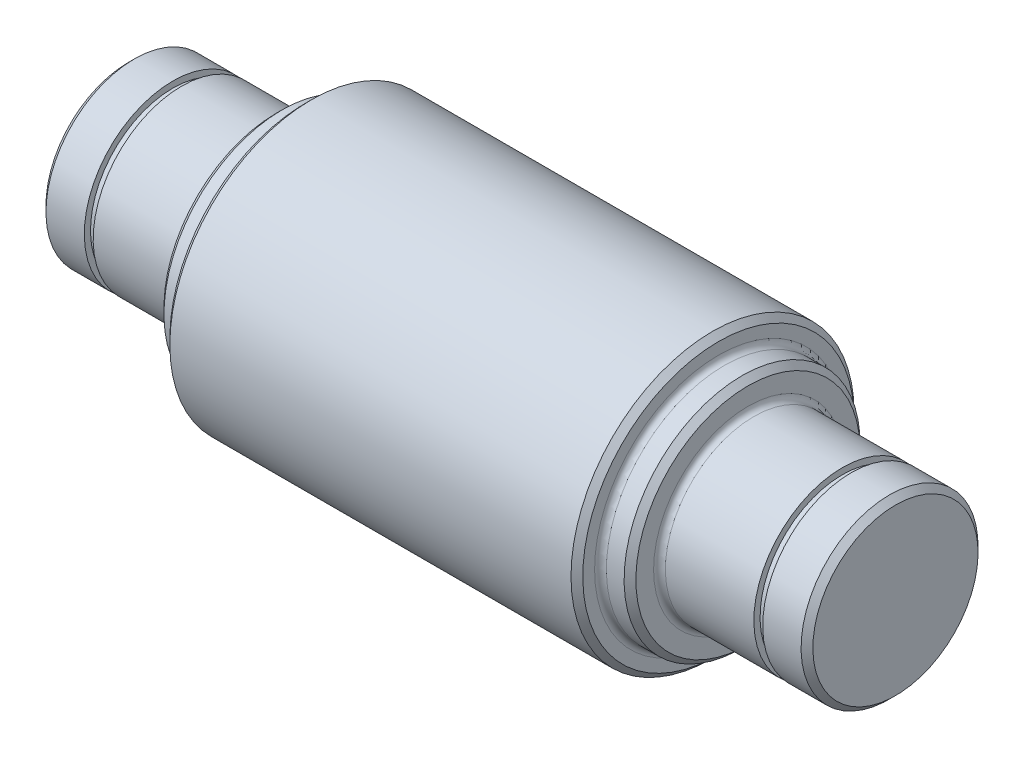
ISO-10303-21;
HEADER;
FILE_DESCRIPTION(('STEP AP214'),'2;1');
FILE_NAME('part.step','',(''),(''),'','','');
FILE_SCHEMA(('AUTOMOTIVE_DESIGN { 1 0 10303 214 1 1 1 1 }'));
ENDSEC;
DATA;
#1=APPLICATION_CONTEXT('core data for automotive mechanical design processes');
#2=APPLICATION_PROTOCOL_DEFINITION('international standard','automotive_design',2000,#1);
#3=PRODUCT_CONTEXT('',#1,'mechanical');
#4=PRODUCT('Part','Part','',(#3));
#5=PRODUCT_RELATED_PRODUCT_CATEGORY('part','',(#4));
#6=PRODUCT_DEFINITION_FORMATION('','',#4);
#7=PRODUCT_DEFINITION_CONTEXT('part definition',#1,'design');
#8=PRODUCT_DEFINITION('design','',#6,#7);
#9=PRODUCT_DEFINITION_SHAPE('','',#8);
#10=(LENGTH_UNIT() NAMED_UNIT(*) SI_UNIT(.MILLI.,.METRE.));
#11=(NAMED_UNIT(*) PLANE_ANGLE_UNIT() SI_UNIT($,.RADIAN.));
#12=(NAMED_UNIT(*) SI_UNIT($,.STERADIAN.) SOLID_ANGLE_UNIT());
#13=UNCERTAINTY_MEASURE_WITH_UNIT(LENGTH_MEASURE(1.E-05),#10,'distance_accuracy_value','');
#14=(GEOMETRIC_REPRESENTATION_CONTEXT(3) GLOBAL_UNCERTAINTY_ASSIGNED_CONTEXT((#13)) GLOBAL_UNIT_ASSIGNED_CONTEXT((#10,
#11,#12)) REPRESENTATION_CONTEXT('',''));
#15=CARTESIAN_POINT('',(0.,0.,0.));
#16=DIRECTION('',(0.,0.,1.));
#17=DIRECTION('',(1.,0.,0.));
#18=AXIS2_PLACEMENT_3D('',#15,#16,#17);
#19=CARTESIAN_POINT('',(16.1248599784287,0.,0.));
#20=DIRECTION('',(-1.,0.,0.));
#21=DIRECTION('',(0.,-1.,0.));
#22=AXIS2_PLACEMENT_3D('',#19,#20,#21);
#23=PLANE('',#22);
#24=CARTESIAN_POINT('',(16.1248599784287,0.,0.));
#25=DIRECTION('',(-1.,0.,0.));
#26=DIRECTION('',(0.,-1.,0.));
#27=AXIS2_PLACEMENT_3D('',#24,#25,#26);
#28=CIRCLE('',#27,13.125);
#29=CARTESIAN_POINT('',(16.1248599784287,-13.125,0.));
#30=VERTEX_POINT('',#29);
#31=EDGE_CURVE('E10',#30,#30,#28,.T.);
#32=ORIENTED_EDGE('',*,*,#31,.F.);
#33=EDGE_LOOP('',(#32));
#34=FACE_BOUND('',#33,.T.);
#35=CARTESIAN_POINT('',(16.1248599784287,0.,0.));
#36=DIRECTION('',(-1.,0.,0.));
#37=DIRECTION('',(0.,-1.,0.));
#38=AXIS2_PLACEMENT_3D('',#35,#36,#37);
#39=CIRCLE('',#38,14.375);
#40=CARTESIAN_POINT('',(16.1248599784287,-14.375,0.));
#41=VERTEX_POINT('',#40);
#42=EDGE_CURVE('E63',#41,#41,#39,.T.);
#43=ORIENTED_EDGE('',*,*,#42,.T.);
#44=EDGE_LOOP('',(#43));
#45=FACE_BOUND('',#44,.T.);
#46=ADVANCED_FACE('F48',(#34,#45),#23,.T.);
#47=CARTESIAN_POINT('',(78.6248599784287,0.,0.));
#48=DIRECTION('',(1.,0.,0.));
#49=DIRECTION('',(0.,1.,0.));
#50=AXIS2_PLACEMENT_3D('',#47,#48,#49);
#51=CYLINDRICAL_SURFACE('',#50,15.);
#52=CARTESIAN_POINT('',(59.2498599784287,0.,0.));
#53=DIRECTION('',(1.,0.,0.));
#54=DIRECTION('',(0.,1.,0.));
#55=AXIS2_PLACEMENT_3D('',#52,#53,#54);
#56=CIRCLE('',#55,15.);
#57=CARTESIAN_POINT('',(59.2498599784287,15.,0.));
#58=VERTEX_POINT('',#57);
#59=EDGE_CURVE('E68',#58,#58,#56,.F.);
#60=ORIENTED_EDGE('',*,*,#59,.T.);
#61=EDGE_LOOP('',(#60));
#62=FACE_BOUND('',#61,.T.);
#63=CARTESIAN_POINT('',(16.7498599784287,0.,0.));
#64=DIRECTION('',(-1.,0.,0.));
#65=DIRECTION('',(0.,-1.,0.));
#66=AXIS2_PLACEMENT_3D('',#63,#64,#65);
#67=CIRCLE('',#66,15.);
#68=CARTESIAN_POINT('',(16.7498599784287,-15.,0.));
#69=VERTEX_POINT('',#68);
#70=EDGE_CURVE('E71',#69,#69,#67,.F.);
#71=ORIENTED_EDGE('',*,*,#70,.T.);
#72=EDGE_LOOP('',(#71));
#73=FACE_BOUND('',#72,.T.);
#74=ADVANCED_FACE('F160',(#62,#73),#51,.T.);
#75=CARTESIAN_POINT('',(59.8748599784287,15.,0.));
#76=DIRECTION('',(1.,0.,0.));
#77=DIRECTION('',(0.,1.,0.));
#78=AXIS2_PLACEMENT_3D('',#75,#76,#77);
#79=PLANE('',#78);
#80=CARTESIAN_POINT('',(59.8748599784287,0.,0.));
#81=DIRECTION('',(1.,0.,0.));
#82=DIRECTION('',(0.,1.,0.));
#83=AXIS2_PLACEMENT_3D('',#80,#81,#82);
#84=CIRCLE('',#83,14.375);
#85=CARTESIAN_POINT('',(59.8748599784287,14.375,0.));
#86=VERTEX_POINT('',#85);
#87=EDGE_CURVE('E74',#86,#86,#84,.T.);
#88=ORIENTED_EDGE('',*,*,#87,.T.);
#89=EDGE_LOOP('',(#88));
#90=FACE_BOUND('',#89,.T.);
#91=CARTESIAN_POINT('',(59.8748599784287,0.,0.));
#92=DIRECTION('',(1.,0.,0.));
#93=DIRECTION('',(0.,1.,0.));
#94=AXIS2_PLACEMENT_3D('',#91,#92,#93);
#95=CIRCLE('',#94,13.125);
#96=CARTESIAN_POINT('',(59.8748599784287,13.125,0.));
#97=VERTEX_POINT('',#96);
#98=EDGE_CURVE('E83',#97,#97,#95,.F.);
#99=ORIENTED_EDGE('',*,*,#98,.T.);
#100=EDGE_LOOP('',(#99));
#101=FACE_BOUND('',#100,.T.);
#102=ADVANCED_FACE('F166',(#90,#101),#79,.T.);
#103=CARTESIAN_POINT('',(78.6248599784287,0.,0.));
#104=DIRECTION('',(1.,0.,0.));
#105=DIRECTION('',(0.,1.,0.));
#106=AXIS2_PLACEMENT_3D('',#103,#104,#105);
#107=CYLINDRICAL_SURFACE('',#106,12.5);
#108=CARTESIAN_POINT('',(62.3748599784287,0.,0.));
#109=DIRECTION('',(1.,0.,0.));
#110=DIRECTION('',(0.,1.,0.));
#111=AXIS2_PLACEMENT_3D('',#108,#109,#110);
#112=CIRCLE('',#111,12.5);
#113=CARTESIAN_POINT('',(62.3748599784287,12.5,0.));
#114=VERTEX_POINT('',#113);
#115=EDGE_CURVE('E77',#114,#114,#112,.F.);
#116=ORIENTED_EDGE('',*,*,#115,.T.);
#117=EDGE_LOOP('',(#116));
#118=FACE_BOUND('',#117,.T.);
#119=CARTESIAN_POINT('',(60.4998599784287,0.,0.));
#120=DIRECTION('',(1.,0.,0.));
#121=DIRECTION('',(0.,1.,0.));
#122=AXIS2_PLACEMENT_3D('',#119,#120,#121);
#123=CIRCLE('',#122,12.5);
#124=CARTESIAN_POINT('',(60.4998599784287,12.5,0.));
#125=VERTEX_POINT('',#124);
#126=EDGE_CURVE('E86',#125,#125,#123,.T.);
#127=ORIENTED_EDGE('',*,*,#126,.T.);
#128=EDGE_LOOP('',(#127));
#129=FACE_BOUND('',#128,.T.);
#130=ADVANCED_FACE('F239',(#118,#129),#107,.T.);
#131=CARTESIAN_POINT('',(62.9998599784287,12.5,0.));
#132=DIRECTION('',(1.,0.,0.));
#133=DIRECTION('',(0.,1.,0.));
#134=AXIS2_PLACEMENT_3D('',#131,#132,#133);
#135=PLANE('',#134);
#136=CARTESIAN_POINT('',(62.9998599784287,0.,0.));
#137=DIRECTION('',(1.,0.,0.));
#138=DIRECTION('',(0.,1.,0.));
#139=AXIS2_PLACEMENT_3D('',#136,#137,#138);
#140=CIRCLE('',#139,11.875);
#141=CARTESIAN_POINT('',(62.9998599784287,11.875,0.));
#142=VERTEX_POINT('',#141);
#143=EDGE_CURVE('E80',#142,#142,#140,.T.);
#144=ORIENTED_EDGE('',*,*,#143,.T.);
#145=EDGE_LOOP('',(#144));
#146=FACE_BOUND('',#145,.T.);
#147=CARTESIAN_POINT('',(62.9998599784287,0.,0.));
#148=DIRECTION('',(1.,0.,0.));
#149=DIRECTION('',(0.,1.,0.));
#150=AXIS2_PLACEMENT_3D('',#147,#148,#149);
#151=CIRCLE('',#150,10.);
#152=CARTESIAN_POINT('',(62.9998599784287,10.,0.));
#153=VERTEX_POINT('',#152);
#154=EDGE_CURVE('E89',#153,#153,#151,.F.);
#155=ORIENTED_EDGE('',*,*,#154,.T.);
#156=EDGE_LOOP('',(#155));
#157=FACE_BOUND('',#156,.T.);
#158=ADVANCED_FACE('F235',(#146,#157),#135,.T.);
#159=CARTESIAN_POINT('',(78.6248599784287,0.,0.));
#160=DIRECTION('',(1.,0.,0.));
#161=DIRECTION('',(0.,1.,0.));
#162=AXIS2_PLACEMENT_3D('',#159,#160,#161);
#163=CYLINDRICAL_SURFACE('',#162,9.375);
#164=CARTESIAN_POINT('',(63.6248599784287,0.,0.));
#165=DIRECTION('',(1.,0.,0.));
#166=DIRECTION('',(0.,1.,0.));
#167=AXIS2_PLACEMENT_3D('',#164,#165,#166);
#168=CIRCLE('',#167,9.375);
#169=CARTESIAN_POINT('',(63.6248599784287,9.375,0.));
#170=VERTEX_POINT('',#169);
#171=EDGE_CURVE('E92',#170,#170,#168,.T.);
#172=ORIENTED_EDGE('',*,*,#171,.T.);
#173=EDGE_LOOP('',(#172));
#174=FACE_BOUND('',#173,.T.);
#175=CARTESIAN_POINT('',(72.9998599784287,0.,0.));
#176=DIRECTION('',(1.,0.,0.));
#177=DIRECTION('',(0.,1.,0.));
#178=AXIS2_PLACEMENT_3D('',#175,#176,#177);
#179=CIRCLE('',#178,9.375);
#180=CARTESIAN_POINT('',(72.9998599784287,9.37499999999999,0.));
#181=VERTEX_POINT('',#180);
#182=EDGE_CURVE('E95',#181,#181,#179,.T.);
#183=ORIENTED_EDGE('',*,*,#182,.F.);
#184=EDGE_LOOP('',(#183));
#185=FACE_BOUND('',#184,.T.);
#186=ADVANCED_FACE('F231',(#174,#185),#163,.T.);
#187=CARTESIAN_POINT('',(72.9998599784287,9.37499999999999,0.));
#188=DIRECTION('',(1.,0.,0.));
#189=DIRECTION('',(0.,1.,0.));
#190=AXIS2_PLACEMENT_3D('',#187,#188,#189);
#191=PLANE('',#190);
#192=ORIENTED_EDGE('',*,*,#182,.T.);
#193=EDGE_LOOP('',(#192));
#194=FACE_BOUND('',#193,.T.);
#195=CARTESIAN_POINT('',(72.9998599784287,0.,0.));
#196=DIRECTION('',(1.,0.,0.));
#197=DIRECTION('',(0.,1.,0.));
#198=AXIS2_PLACEMENT_3D('',#195,#196,#197);
#199=CIRCLE('',#198,8.71875);
#200=CARTESIAN_POINT('',(72.9998599784287,8.71875,0.));
#201=VERTEX_POINT('',#200);
#202=EDGE_CURVE('E98',#201,#201,#199,.T.);
#203=ORIENTED_EDGE('',*,*,#202,.F.);
#204=EDGE_LOOP('',(#203));
#205=FACE_BOUND('',#204,.T.);
#206=ADVANCED_FACE('F227',(#194,#205),#191,.T.);
#207=CARTESIAN_POINT('',(78.6248599784287,0.,0.));
#208=DIRECTION('',(1.,0.,0.));
#209=DIRECTION('',(0.,1.,0.));
#210=AXIS2_PLACEMENT_3D('',#207,#208,#209);
#211=CYLINDRICAL_SURFACE('',#210,8.71875);
#212=ORIENTED_EDGE('',*,*,#202,.T.);
#213=EDGE_LOOP('',(#212));
#214=FACE_BOUND('',#213,.T.);
#215=CARTESIAN_POINT('',(73.9373599784287,0.,0.));
#216=DIRECTION('',(1.,0.,0.));
#217=DIRECTION('',(0.,1.,0.));
#218=AXIS2_PLACEMENT_3D('',#215,#216,#217);
#219=CIRCLE('',#218,8.71875);
#220=CARTESIAN_POINT('',(73.9373599784287,8.71875,0.));
#221=VERTEX_POINT('',#220);
#222=EDGE_CURVE('E101',#221,#221,#219,.T.);
#223=ORIENTED_EDGE('',*,*,#222,.F.);
#224=EDGE_LOOP('',(#223));
#225=FACE_BOUND('',#224,.T.);
#226=ADVANCED_FACE('F223',(#214,#225),#211,.T.);
#227=CARTESIAN_POINT('',(73.9373599784287,8.71875,0.));
#228=DIRECTION('',(-1.,0.,0.));
#229=DIRECTION('',(0.,-1.,0.));
#230=AXIS2_PLACEMENT_3D('',#227,#228,#229);
#231=PLANE('',#230);
#232=ORIENTED_EDGE('',*,*,#222,.T.);
#233=EDGE_LOOP('',(#232));
#234=FACE_BOUND('',#233,.T.);
#235=CARTESIAN_POINT('',(73.9373599784287,0.,0.));
#236=DIRECTION('',(1.,0.,0.));
#237=DIRECTION('',(0.,1.,0.));
#238=AXIS2_PLACEMENT_3D('',#235,#236,#237);
#239=CIRCLE('',#238,9.375);
#240=CARTESIAN_POINT('',(73.9373599784287,9.37499999999999,0.));
#241=VERTEX_POINT('',#240);
#242=EDGE_CURVE('E104',#241,#241,#239,.T.);
#243=ORIENTED_EDGE('',*,*,#242,.F.);
#244=EDGE_LOOP('',(#243));
#245=FACE_BOUND('',#244,.T.);
#246=ADVANCED_FACE('F215',(#234,#245),#231,.T.);
#247=CARTESIAN_POINT('',(78.6248599784287,0.,0.));
#248=DIRECTION('',(1.,0.,0.));
#249=DIRECTION('',(0.,1.,0.));
#250=AXIS2_PLACEMENT_3D('',#247,#248,#249);
#251=CYLINDRICAL_SURFACE('',#250,9.375);
#252=CARTESIAN_POINT('',(77.9998599784287,0.,0.));
#253=DIRECTION('',(1.,0.,0.));
#254=DIRECTION('',(0.,1.,0.));
#255=AXIS2_PLACEMENT_3D('',#252,#253,#254);
#256=CIRCLE('',#255,9.375);
#257=CARTESIAN_POINT('',(77.9998599784287,9.37499999999999,0.));
#258=VERTEX_POINT('',#257);
#259=EDGE_CURVE('E55',#258,#258,#256,.F.);
#260=ORIENTED_EDGE('',*,*,#259,.T.);
#261=EDGE_LOOP('',(#260));
#262=FACE_BOUND('',#261,.T.);
#263=ORIENTED_EDGE('',*,*,#242,.T.);
#264=EDGE_LOOP('',(#263));
#265=FACE_BOUND('',#264,.T.);
#266=ADVANCED_FACE('F210',(#262,#265),#251,.T.);
#267=CARTESIAN_POINT('',(78.6248599784287,9.37499999999999,0.));
#268=DIRECTION('',(1.,0.,0.));
#269=DIRECTION('',(0.,1.,0.));
#270=AXIS2_PLACEMENT_3D('',#267,#268,#269);
#271=PLANE('',#270);
#272=CARTESIAN_POINT('',(78.6248599784287,0.,0.));
#273=DIRECTION('',(1.,0.,0.));
#274=DIRECTION('',(0.,1.,0.));
#275=AXIS2_PLACEMENT_3D('',#272,#273,#274);
#276=CIRCLE('',#275,8.75);
#277=CARTESIAN_POINT('',(78.6248599784287,8.75,0.));
#278=VERTEX_POINT('',#277);
#279=EDGE_CURVE('E59',#278,#278,#276,.T.);
#280=ORIENTED_EDGE('',*,*,#279,.T.);
#281=EDGE_LOOP('',(#280));
#282=FACE_BOUND('',#281,.T.);
#283=ADVANCED_FACE('F176',(#282),#271,.T.);
#284=CARTESIAN_POINT('',(63.6248599784287,0.,0.));
#285=DIRECTION('',(1.,0.,0.));
#286=DIRECTION('',(0.,1.,0.));
#287=AXIS2_PLACEMENT_3D('',#284,#285,#286);
#288=TOROIDAL_SURFACE('',#287,10.,0.625);
#289=ORIENTED_EDGE('',*,*,#154,.F.);
#290=EDGE_LOOP('',(#289));
#291=FACE_BOUND('',#290,.T.);
#292=ORIENTED_EDGE('',*,*,#171,.F.);
#293=EDGE_LOOP('',(#292));
#294=FACE_BOUND('',#293,.T.);
#295=ADVANCED_FACE('F172',(#291,#294),#288,.F.);
#296=CARTESIAN_POINT('',(60.4998599784287,0.,0.));
#297=DIRECTION('',(1.,0.,0.));
#298=DIRECTION('',(0.,1.,0.));
#299=AXIS2_PLACEMENT_3D('',#296,#297,#298);
#300=TOROIDAL_SURFACE('',#299,13.125,0.625);
#301=ORIENTED_EDGE('',*,*,#98,.F.);
#302=EDGE_LOOP('',(#301));
#303=FACE_BOUND('',#302,.T.);
#304=ORIENTED_EDGE('',*,*,#126,.F.);
#305=EDGE_LOOP('',(#304));
#306=FACE_BOUND('',#305,.T.);
#307=ADVANCED_FACE('F175',(#303,#306),#300,.F.);
#308=CARTESIAN_POINT('',(62.9998599784287,0.,0.));
#309=DIRECTION('',(-1.,0.,0.));
#310=DIRECTION('',(0.,-1.,0.));
#311=AXIS2_PLACEMENT_3D('',#308,#309,#310);
#312=CONICAL_SURFACE('',#311,11.875,0.785398163397445);
#313=ORIENTED_EDGE('',*,*,#115,.F.);
#314=EDGE_LOOP('',(#313));
#315=FACE_BOUND('',#314,.T.);
#316=ORIENTED_EDGE('',*,*,#143,.F.);
#317=EDGE_LOOP('',(#316));
#318=FACE_BOUND('',#317,.T.);
#319=ADVANCED_FACE('F180',(#315,#318),#312,.T.);
#320=CARTESIAN_POINT('',(59.8748599784287,0.,0.));
#321=DIRECTION('',(-1.,0.,0.));
#322=DIRECTION('',(0.,-1.,0.));
#323=AXIS2_PLACEMENT_3D('',#320,#321,#322);
#324=CONICAL_SURFACE('',#323,14.375,0.785398163397438);
#325=ORIENTED_EDGE('',*,*,#59,.F.);
#326=EDGE_LOOP('',(#325));
#327=FACE_BOUND('',#326,.T.);
#328=ORIENTED_EDGE('',*,*,#87,.F.);
#329=EDGE_LOOP('',(#328));
#330=FACE_BOUND('',#329,.T.);
#331=ADVANCED_FACE('F184',(#327,#330),#324,.T.);
#332=CARTESIAN_POINT('',(16.7498599784287,0.,0.));
#333=DIRECTION('',(1.,0.,0.));
#334=DIRECTION('',(0.,1.,0.));
#335=AXIS2_PLACEMENT_3D('',#332,#333,#334);
#336=CONICAL_SURFACE('',#335,15.,0.785398163397452);
#337=ORIENTED_EDGE('',*,*,#42,.F.);
#338=EDGE_LOOP('',(#337));
#339=FACE_BOUND('',#338,.T.);
#340=ORIENTED_EDGE('',*,*,#70,.F.);
#341=EDGE_LOOP('',(#340));
#342=FACE_BOUND('',#341,.T.);
#343=ADVANCED_FACE('F187',(#339,#342),#336,.T.);
#344=CARTESIAN_POINT('',(78.6248599784287,0.,0.));
#345=DIRECTION('',(-1.,0.,0.));
#346=DIRECTION('',(0.,-1.,0.));
#347=AXIS2_PLACEMENT_3D('',#344,#345,#346);
#348=CONICAL_SURFACE('',#347,8.75,0.785398163397447);
#349=ORIENTED_EDGE('',*,*,#259,.F.);
#350=EDGE_LOOP('',(#349));
#351=FACE_BOUND('',#350,.T.);
#352=ORIENTED_EDGE('',*,*,#279,.F.);
#353=EDGE_LOOP('',(#352));
#354=FACE_BOUND('',#353,.T.);
#355=ADVANCED_FACE('F50',(#351,#354),#348,.T.);
#356=CARTESIAN_POINT('',(-2.62514002157131,0.,0.));
#357=DIRECTION('',(-1.,0.,0.));
#358=DIRECTION('',(0.,1.,0.));
#359=AXIS2_PLACEMENT_3D('',#356,#357,#358);
#360=CYLINDRICAL_SURFACE('',#359,12.5);
#361=CARTESIAN_POINT('',(13.6248599784287,0.,0.));
#362=DIRECTION('',(1.,0.,0.));
#363=DIRECTION('',(0.,1.,0.));
#364=AXIS2_PLACEMENT_3D('',#361,#362,#363);
#365=CIRCLE('',#364,12.5);
#366=CARTESIAN_POINT('',(13.6248599784287,12.5,0.));
#367=VERTEX_POINT('',#366);
#368=EDGE_CURVE('E113',#367,#367,#365,.F.);
#369=ORIENTED_EDGE('',*,*,#368,.F.);
#370=EDGE_LOOP('',(#369));
#371=FACE_BOUND('',#370,.T.);
#372=CARTESIAN_POINT('',(15.4998599784287,0.,0.));
#373=DIRECTION('',(1.,0.,0.));
#374=DIRECTION('',(0.,1.,0.));
#375=AXIS2_PLACEMENT_3D('',#372,#373,#374);
#376=CIRCLE('',#375,12.5);
#377=CARTESIAN_POINT('',(15.4998599784287,12.5,0.));
#378=VERTEX_POINT('',#377);
#379=EDGE_CURVE('E119',#378,#378,#376,.T.);
#380=ORIENTED_EDGE('',*,*,#379,.F.);
#381=EDGE_LOOP('',(#380));
#382=FACE_BOUND('',#381,.T.);
#383=ADVANCED_FACE('F194',(#371,#382),#360,.T.);
#384=CARTESIAN_POINT('',(12.9998599784287,12.5,0.));
#385=DIRECTION('',(-1.,0.,0.));
#386=DIRECTION('',(0.,1.,0.));
#387=AXIS2_PLACEMENT_3D('',#384,#385,#386);
#388=PLANE('',#387);
#389=CARTESIAN_POINT('',(12.9998599784287,0.,0.));
#390=DIRECTION('',(1.,0.,0.));
#391=DIRECTION('',(0.,1.,0.));
#392=AXIS2_PLACEMENT_3D('',#389,#390,#391);
#393=CIRCLE('',#392,11.875);
#394=CARTESIAN_POINT('',(12.9998599784287,11.875,0.));
#395=VERTEX_POINT('',#394);
#396=EDGE_CURVE('E116',#395,#395,#393,.T.);
#397=ORIENTED_EDGE('',*,*,#396,.F.);
#398=EDGE_LOOP('',(#397));
#399=FACE_BOUND('',#398,.T.);
#400=CARTESIAN_POINT('',(12.9998599784287,0.,0.));
#401=DIRECTION('',(1.,0.,0.));
#402=DIRECTION('',(0.,1.,0.));
#403=AXIS2_PLACEMENT_3D('',#400,#401,#402);
#404=CIRCLE('',#403,10.);
#405=CARTESIAN_POINT('',(12.9998599784287,10.,0.));
#406=VERTEX_POINT('',#405);
#407=EDGE_CURVE('E122',#406,#406,#404,.F.);
#408=ORIENTED_EDGE('',*,*,#407,.F.);
#409=EDGE_LOOP('',(#408));
#410=FACE_BOUND('',#409,.T.);
#411=ADVANCED_FACE('F203',(#399,#410),#388,.T.);
#412=CARTESIAN_POINT('',(-2.62514002157131,0.,0.));
#413=DIRECTION('',(-1.,0.,0.));
#414=DIRECTION('',(0.,1.,0.));
#415=AXIS2_PLACEMENT_3D('',#412,#413,#414);
#416=CYLINDRICAL_SURFACE('',#415,9.375);
#417=CARTESIAN_POINT('',(12.3748599784287,0.,0.));
#418=DIRECTION('',(1.,0.,0.));
#419=DIRECTION('',(0.,1.,0.));
#420=AXIS2_PLACEMENT_3D('',#417,#418,#419);
#421=CIRCLE('',#420,9.375);
#422=CARTESIAN_POINT('',(12.3748599784287,9.375,0.));
#423=VERTEX_POINT('',#422);
#424=EDGE_CURVE('E125',#423,#423,#421,.T.);
#425=ORIENTED_EDGE('',*,*,#424,.F.);
#426=EDGE_LOOP('',(#425));
#427=FACE_BOUND('',#426,.T.);
#428=CARTESIAN_POINT('',(2.99985997842868,0.,0.));
#429=DIRECTION('',(1.,0.,0.));
#430=DIRECTION('',(0.,1.,0.));
#431=AXIS2_PLACEMENT_3D('',#428,#429,#430);
#432=CIRCLE('',#431,9.375);
#433=CARTESIAN_POINT('',(2.99985997842868,9.375,0.));
#434=VERTEX_POINT('',#433);
#435=EDGE_CURVE('E128',#434,#434,#432,.T.);
#436=ORIENTED_EDGE('',*,*,#435,.T.);
#437=EDGE_LOOP('',(#436));
#438=FACE_BOUND('',#437,.T.);
#439=ADVANCED_FACE('F306',(#427,#438),#416,.T.);
#440=CARTESIAN_POINT('',(2.99985997842868,9.375,0.));
#441=DIRECTION('',(-1.,0.,0.));
#442=DIRECTION('',(0.,1.,0.));
#443=AXIS2_PLACEMENT_3D('',#440,#441,#442);
#444=PLANE('',#443);
#445=ORIENTED_EDGE('',*,*,#435,.F.);
#446=EDGE_LOOP('',(#445));
#447=FACE_BOUND('',#446,.T.);
#448=CARTESIAN_POINT('',(2.99985997842868,0.,0.));
#449=DIRECTION('',(1.,0.,0.));
#450=DIRECTION('',(0.,1.,0.));
#451=AXIS2_PLACEMENT_3D('',#448,#449,#450);
#452=CIRCLE('',#451,8.71875);
#453=CARTESIAN_POINT('',(2.99985997842868,8.71875,0.));
#454=VERTEX_POINT('',#453);
#455=EDGE_CURVE('E131',#454,#454,#452,.T.);
#456=ORIENTED_EDGE('',*,*,#455,.T.);
#457=EDGE_LOOP('',(#456));
#458=FACE_BOUND('',#457,.T.);
#459=ADVANCED_FACE('F316',(#447,#458),#444,.T.);
#460=CARTESIAN_POINT('',(-2.62514002157131,0.,0.));
#461=DIRECTION('',(-1.,0.,0.));
#462=DIRECTION('',(0.,1.,0.));
#463=AXIS2_PLACEMENT_3D('',#460,#461,#462);
#464=CYLINDRICAL_SURFACE('',#463,8.71875);
#465=ORIENTED_EDGE('',*,*,#455,.F.);
#466=EDGE_LOOP('',(#465));
#467=FACE_BOUND('',#466,.T.);
#468=CARTESIAN_POINT('',(2.06235997842869,0.,0.));
#469=DIRECTION('',(1.,0.,0.));
#470=DIRECTION('',(0.,1.,0.));
#471=AXIS2_PLACEMENT_3D('',#468,#469,#470);
#472=CIRCLE('',#471,8.71875);
#473=CARTESIAN_POINT('',(2.06235997842869,8.71875,0.));
#474=VERTEX_POINT('',#473);
#475=EDGE_CURVE('E134',#474,#474,#472,.T.);
#476=ORIENTED_EDGE('',*,*,#475,.T.);
#477=EDGE_LOOP('',(#476));
#478=FACE_BOUND('',#477,.T.);
#479=ADVANCED_FACE('F155',(#467,#478),#464,.T.);
#480=CARTESIAN_POINT('',(2.06235997842869,8.71875,0.));
#481=DIRECTION('',(1.,0.,0.));
#482=DIRECTION('',(0.,-1.,0.));
#483=AXIS2_PLACEMENT_3D('',#480,#481,#482);
#484=PLANE('',#483);
#485=ORIENTED_EDGE('',*,*,#475,.F.);
#486=EDGE_LOOP('',(#485));
#487=FACE_BOUND('',#486,.T.);
#488=CARTESIAN_POINT('',(2.06235997842869,0.,0.));
#489=DIRECTION('',(1.,0.,0.));
#490=DIRECTION('',(0.,1.,0.));
#491=AXIS2_PLACEMENT_3D('',#488,#489,#490);
#492=CIRCLE('',#491,9.375);
#493=CARTESIAN_POINT('',(2.06235997842869,9.375,0.));
#494=VERTEX_POINT('',#493);
#495=EDGE_CURVE('E137',#494,#494,#492,.T.);
#496=ORIENTED_EDGE('',*,*,#495,.T.);
#497=EDGE_LOOP('',(#496));
#498=FACE_BOUND('',#497,.T.);
#499=ADVANCED_FACE('F141',(#487,#498),#484,.T.);
#500=CARTESIAN_POINT('',(-2.62514002157131,0.,0.));
#501=DIRECTION('',(-1.,0.,0.));
#502=DIRECTION('',(0.,1.,0.));
#503=AXIS2_PLACEMENT_3D('',#500,#501,#502);
#504=CYLINDRICAL_SURFACE('',#503,9.375);
#505=CARTESIAN_POINT('',(-2.00014002157131,0.,0.));
#506=DIRECTION('',(1.,0.,0.));
#507=DIRECTION('',(0.,1.,0.));
#508=AXIS2_PLACEMENT_3D('',#505,#506,#507);
#509=CIRCLE('',#508,9.375);
#510=CARTESIAN_POINT('',(-2.00014002157131,9.375,0.));
#511=VERTEX_POINT('',#510);
#512=EDGE_CURVE('E107',#511,#511,#509,.F.);
#513=ORIENTED_EDGE('',*,*,#512,.F.);
#514=EDGE_LOOP('',(#513));
#515=FACE_BOUND('',#514,.T.);
#516=ORIENTED_EDGE('',*,*,#495,.F.);
#517=EDGE_LOOP('',(#516));
#518=FACE_BOUND('',#517,.T.);
#519=ADVANCED_FACE('F143',(#515,#518),#504,.T.);
#520=CARTESIAN_POINT('',(-2.62514002157131,9.375,0.));
#521=DIRECTION('',(-1.,0.,0.));
#522=DIRECTION('',(0.,1.,0.));
#523=AXIS2_PLACEMENT_3D('',#520,#521,#522);
#524=PLANE('',#523);
#525=CARTESIAN_POINT('',(-2.62514002157131,0.,0.));
#526=DIRECTION('',(1.,0.,0.));
#527=DIRECTION('',(0.,1.,0.));
#528=AXIS2_PLACEMENT_3D('',#525,#526,#527);
#529=CIRCLE('',#528,8.75);
#530=CARTESIAN_POINT('',(-2.62514002157131,8.75,0.));
#531=VERTEX_POINT('',#530);
#532=EDGE_CURVE('E110',#531,#531,#529,.T.);
#533=ORIENTED_EDGE('',*,*,#532,.F.);
#534=EDGE_LOOP('',(#533));
#535=FACE_BOUND('',#534,.T.);
#536=ADVANCED_FACE('F145',(#535),#524,.T.);
#537=CARTESIAN_POINT('',(12.3748599784287,0.,0.));
#538=DIRECTION('',(-1.,0.,0.));
#539=DIRECTION('',(0.,1.,0.));
#540=AXIS2_PLACEMENT_3D('',#537,#538,#539);
#541=TOROIDAL_SURFACE('',#540,10.,0.625);
#542=ORIENTED_EDGE('',*,*,#407,.T.);
#543=EDGE_LOOP('',(#542));
#544=FACE_BOUND('',#543,.T.);
#545=ORIENTED_EDGE('',*,*,#424,.T.);
#546=EDGE_LOOP('',(#545));
#547=FACE_BOUND('',#546,.T.);
#548=ADVANCED_FACE('F152',(#544,#547),#541,.F.);
#549=CARTESIAN_POINT('',(15.4998599784287,0.,0.));
#550=DIRECTION('',(-1.,0.,0.));
#551=DIRECTION('',(0.,1.,0.));
#552=AXIS2_PLACEMENT_3D('',#549,#550,#551);
#553=TOROIDAL_SURFACE('',#552,13.125,0.625);
#554=ORIENTED_EDGE('',*,*,#31,.T.);
#555=EDGE_LOOP('',(#554));
#556=FACE_BOUND('',#555,.T.);
#557=ORIENTED_EDGE('',*,*,#379,.T.);
#558=EDGE_LOOP('',(#557));
#559=FACE_BOUND('',#558,.T.);
#560=ADVANCED_FACE('F361',(#556,#559),#553,.F.);
#561=CARTESIAN_POINT('',(12.9998599784287,0.,0.));
#562=DIRECTION('',(1.,0.,0.));
#563=DIRECTION('',(0.,-1.,0.));
#564=AXIS2_PLACEMENT_3D('',#561,#562,#563);
#565=CONICAL_SURFACE('',#564,11.875,0.785398163397445);
#566=ORIENTED_EDGE('',*,*,#368,.T.);
#567=EDGE_LOOP('',(#566));
#568=FACE_BOUND('',#567,.T.);
#569=ORIENTED_EDGE('',*,*,#396,.T.);
#570=EDGE_LOOP('',(#569));
#571=FACE_BOUND('',#570,.T.);
#572=ADVANCED_FACE('F371',(#568,#571),#565,.T.);
#573=CARTESIAN_POINT('',(-2.62514002157131,0.,0.));
#574=DIRECTION('',(1.,0.,0.));
#575=DIRECTION('',(0.,-1.,0.));
#576=AXIS2_PLACEMENT_3D('',#573,#574,#575);
#577=CONICAL_SURFACE('',#576,8.75,0.785398163397447);
#578=ORIENTED_EDGE('',*,*,#512,.T.);
#579=EDGE_LOOP('',(#578));
#580=FACE_BOUND('',#579,.T.);
#581=ORIENTED_EDGE('',*,*,#532,.T.);
#582=EDGE_LOOP('',(#581));
#583=FACE_BOUND('',#582,.T.);
#584=ADVANCED_FACE('F218',(#580,#583),#577,.T.);
#585=CLOSED_SHELL('',(#46,#74,#102,#130,#158,#186,#206,#226,#246,#266,#283,#295,#307,#319,#331,
#343,#355,#383,#411,#439,#459,#479,#499,#519,#536,#548,#560,#572,#584));
#586=MANIFOLD_SOLID_BREP('B2',#585);
#587=ADVANCED_BREP_SHAPE_REPRESENTATION('',(#18,#586),#14);
#588=SHAPE_DEFINITION_REPRESENTATION(#9,#587);
ENDSEC;
END-ISO-10303-21;
